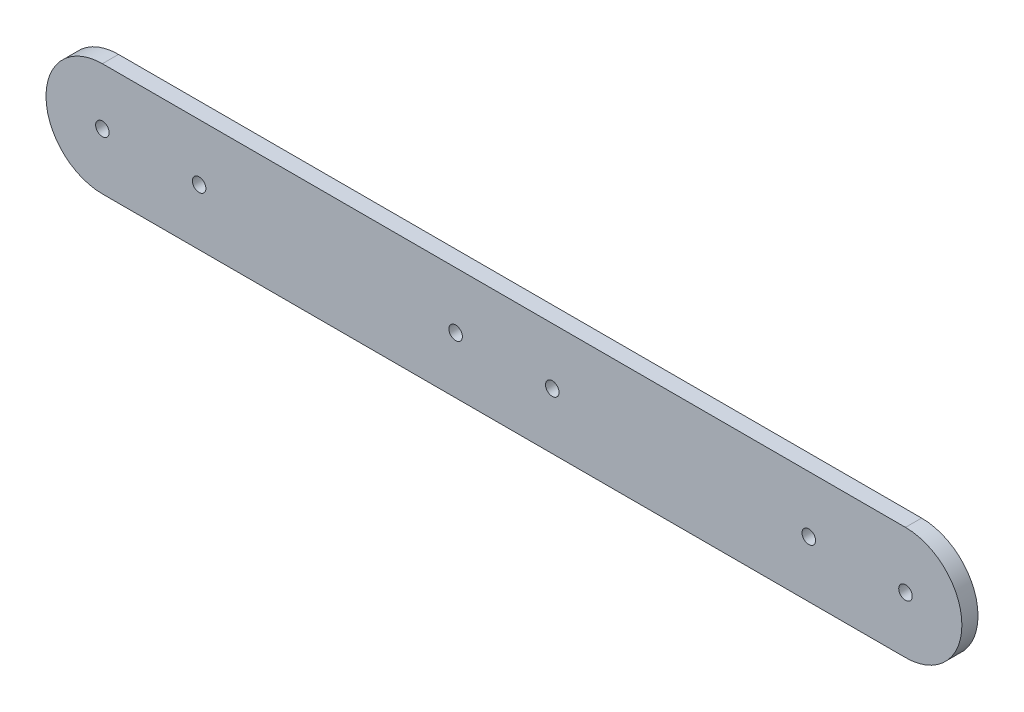
ISO-10303-21;
HEADER;
FILE_DESCRIPTION(('STEP AP214'),'2;1');
FILE_NAME('part.step','',(''),(''),'','','');
FILE_SCHEMA(('AUTOMOTIVE_DESIGN { 1 0 10303 214 1 1 1 1 }'));
ENDSEC;
DATA;
#1=APPLICATION_CONTEXT('core data for automotive mechanical design processes');
#2=APPLICATION_PROTOCOL_DEFINITION('international standard','automotive_design',2000,#1);
#3=PRODUCT_CONTEXT('',#1,'mechanical');
#4=PRODUCT('Part','Part','',(#3));
#5=PRODUCT_RELATED_PRODUCT_CATEGORY('part','',(#4));
#6=PRODUCT_DEFINITION_FORMATION('','',#4);
#7=PRODUCT_DEFINITION_CONTEXT('part definition',#1,'design');
#8=PRODUCT_DEFINITION('design','',#6,#7);
#9=PRODUCT_DEFINITION_SHAPE('','',#8);
#10=(LENGTH_UNIT() NAMED_UNIT(*) SI_UNIT(.MILLI.,.METRE.));
#11=(NAMED_UNIT(*) PLANE_ANGLE_UNIT() SI_UNIT($,.RADIAN.));
#12=(NAMED_UNIT(*) SI_UNIT($,.STERADIAN.) SOLID_ANGLE_UNIT());
#13=UNCERTAINTY_MEASURE_WITH_UNIT(LENGTH_MEASURE(1.E-05),#10,'distance_accuracy_value','');
#14=(GEOMETRIC_REPRESENTATION_CONTEXT(3) GLOBAL_UNCERTAINTY_ASSIGNED_CONTEXT((#13)) GLOBAL_UNIT_ASSIGNED_CONTEXT((#10,
#11,#12)) REPRESENTATION_CONTEXT('',''));
#15=CARTESIAN_POINT('',(0.,0.,0.));
#16=DIRECTION('',(0.,0.,1.));
#17=DIRECTION('',(1.,0.,0.));
#18=AXIS2_PLACEMENT_3D('',#15,#16,#17);
#19=CARTESIAN_POINT('',(51.6288857536475,81.700000000969,5.));
#20=DIRECTION('',(0.,0.,1.));
#21=DIRECTION('',(1.,0.,0.));
#22=AXIS2_PLACEMENT_3D('',#19,#20,#21);
#23=PLANE('',#22);
#24=CARTESIAN_POINT('',(81.6288857536475,81.700000000969,5.));
#25=DIRECTION('',(0.,0.,1.));
#26=DIRECTION('',(1.,0.,0.));
#27=AXIS2_PLACEMENT_3D('',#24,#25,#26);
#28=CIRCLE('',#27,2.1);
#29=CARTESIAN_POINT('',(83.7288857536475,81.700000000969,5.));
#30=VERTEX_POINT('',#29);
#31=EDGE_CURVE('E162',#30,#30,#28,.T.);
#32=ORIENTED_EDGE('',*,*,#31,.F.);
#33=EDGE_LOOP('',(#32));
#34=FACE_BOUND('',#33,.T.);
#35=CARTESIAN_POINT('',(191.222895530697,81.700000000969,5.));
#36=DIRECTION('',(0.,0.,1.));
#37=DIRECTION('',(1.,0.,0.));
#38=AXIS2_PLACEMENT_3D('',#35,#36,#37);
#39=CIRCLE('',#38,2.10000000000002);
#40=CARTESIAN_POINT('',(193.322895530697,81.700000000969,5.));
#41=VERTEX_POINT('',#40);
#42=EDGE_CURVE('E146',#41,#41,#39,.T.);
#43=ORIENTED_EDGE('',*,*,#42,.F.);
#44=EDGE_LOOP('',(#43));
#45=FACE_BOUND('',#44,.T.);
#46=CARTESIAN_POINT('',(300.816905307747,81.700000000969,5.));
#47=DIRECTION('',(0.,0.,1.));
#48=DIRECTION('',(1.,0.,0.));
#49=AXIS2_PLACEMENT_3D('',#46,#47,#48);
#50=CIRCLE('',#49,2.09999999999999);
#51=CARTESIAN_POINT('',(302.916905307747,81.700000000969,5.));
#52=VERTEX_POINT('',#51);
#53=EDGE_CURVE('E116',#52,#52,#50,.T.);
#54=ORIENTED_EDGE('',*,*,#53,.F.);
#55=EDGE_LOOP('',(#54));
#56=FACE_BOUND('',#55,.T.);
#57=CARTESIAN_POINT('',(51.6288857536475,81.700000000969,5.));
#58=DIRECTION('',(0.,0.,1.));
#59=DIRECTION('',(1.,0.,0.));
#60=AXIS2_PLACEMENT_3D('',#57,#58,#59);
#61=CIRCLE('',#60,17.5);
#62=CARTESIAN_POINT('',(51.6288857536475,99.200000000969,5.));
#63=VERTEX_POINT('',#62);
#64=CARTESIAN_POINT('',(51.6288857536475,64.200000000969,5.));
#65=VERTEX_POINT('',#64);
#66=EDGE_CURVE('E96',#63,#65,#61,.T.);
#67=ORIENTED_EDGE('',*,*,#66,.T.);
#68=DIRECTION('',(1.,0.,0.));
#69=VECTOR('',#68,1.);
#70=CARTESIAN_POINT('',(51.6288857536475,64.200000000969,5.));
#71=LINE('',#70,#69);
#72=CARTESIAN_POINT('',(300.816905307747,64.200000000969,5.));
#73=VERTEX_POINT('',#72);
#74=EDGE_CURVE('E91',#65,#73,#71,.T.);
#75=ORIENTED_EDGE('',*,*,#74,.T.);
#76=CARTESIAN_POINT('',(300.816905307747,81.700000000969,5.));
#77=DIRECTION('',(0.,0.,1.));
#78=DIRECTION('',(1.,0.,0.));
#79=AXIS2_PLACEMENT_3D('',#76,#77,#78);
#80=CIRCLE('',#79,17.5);
#81=CARTESIAN_POINT('',(300.816905307747,99.200000000969,5.));
#82=VERTEX_POINT('',#81);
#83=EDGE_CURVE('E94',#73,#82,#80,.T.);
#84=ORIENTED_EDGE('',*,*,#83,.T.);
#85=DIRECTION('',(-1.,0.,0.));
#86=VECTOR('',#85,1.);
#87=CARTESIAN_POINT('',(51.6288857536475,99.200000000969,5.));
#88=LINE('',#87,#86);
#89=EDGE_CURVE('E61',#82,#63,#88,.T.);
#90=ORIENTED_EDGE('',*,*,#89,.T.);
#91=EDGE_LOOP('',(#67,#75,#84,#90));
#92=FACE_BOUND('',#91,.T.);
#93=CARTESIAN_POINT('',(270.816905307747,81.700000000969,5.));
#94=DIRECTION('',(0.,0.,1.));
#95=DIRECTION('',(1.,0.,0.));
#96=AXIS2_PLACEMENT_3D('',#93,#94,#95);
#97=CIRCLE('',#96,2.09999999999999);
#98=CARTESIAN_POINT('',(272.916905307747,81.700000000969,5.));
#99=VERTEX_POINT('',#98);
#100=EDGE_CURVE('E138',#99,#99,#97,.T.);
#101=ORIENTED_EDGE('',*,*,#100,.F.);
#102=EDGE_LOOP('',(#101));
#103=FACE_BOUND('',#102,.T.);
#104=CARTESIAN_POINT('',(51.6288857536475,81.700000000969,5.));
#105=DIRECTION('',(0.,0.,1.));
#106=DIRECTION('',(1.,0.,0.));
#107=AXIS2_PLACEMENT_3D('',#104,#105,#106);
#108=CIRCLE('',#107,2.1);
#109=CARTESIAN_POINT('',(53.7288857536475,81.700000000969,5.));
#110=VERTEX_POINT('',#109);
#111=EDGE_CURVE('E154',#110,#110,#108,.T.);
#112=ORIENTED_EDGE('',*,*,#111,.F.);
#113=EDGE_LOOP('',(#112));
#114=FACE_BOUND('',#113,.T.);
#115=CARTESIAN_POINT('',(161.222895530697,81.700000000969,5.));
#116=DIRECTION('',(0.,0.,1.));
#117=DIRECTION('',(1.,0.,0.));
#118=AXIS2_PLACEMENT_3D('',#115,#116,#117);
#119=CIRCLE('',#118,2.09999999999999);
#120=CARTESIAN_POINT('',(163.322895530697,81.700000000969,5.));
#121=VERTEX_POINT('',#120);
#122=EDGE_CURVE('E170',#121,#121,#119,.T.);
#123=ORIENTED_EDGE('',*,*,#122,.F.);
#124=EDGE_LOOP('',(#123));
#125=FACE_BOUND('',#124,.T.);
#126=ADVANCED_FACE('F43',(#34,#45,#56,#92,#103,#114,#125),#23,.T.);
#127=CARTESIAN_POINT('',(51.6288857536475,81.700000000969,0.));
#128=DIRECTION('',(0.,0.,1.));
#129=DIRECTION('',(1.,0.,0.));
#130=AXIS2_PLACEMENT_3D('',#127,#128,#129);
#131=PLANE('',#130);
#132=CARTESIAN_POINT('',(51.6288857536475,81.700000000969,0.));
#133=DIRECTION('',(0.,0.,1.));
#134=DIRECTION('',(1.,0.,0.));
#135=AXIS2_PLACEMENT_3D('',#132,#133,#134);
#136=CIRCLE('',#135,17.5);
#137=CARTESIAN_POINT('',(51.6288857536475,99.200000000969,0.));
#138=VERTEX_POINT('',#137);
#139=CARTESIAN_POINT('',(51.6288857536475,64.200000000969,0.));
#140=VERTEX_POINT('',#139);
#141=EDGE_CURVE('E112',#138,#140,#136,.T.);
#142=ORIENTED_EDGE('',*,*,#141,.F.);
#143=DIRECTION('',(-1.,0.,0.));
#144=VECTOR('',#143,1.);
#145=CARTESIAN_POINT('',(51.6288857536475,99.200000000969,0.));
#146=LINE('',#145,#144);
#147=CARTESIAN_POINT('',(300.816905307747,99.200000000969,0.));
#148=VERTEX_POINT('',#147);
#149=EDGE_CURVE('E84',#148,#138,#146,.T.);
#150=ORIENTED_EDGE('',*,*,#149,.F.);
#151=CARTESIAN_POINT('',(300.816905307747,81.700000000969,0.));
#152=DIRECTION('',(0.,0.,1.));
#153=DIRECTION('',(1.,0.,0.));
#154=AXIS2_PLACEMENT_3D('',#151,#152,#153);
#155=CIRCLE('',#154,17.5);
#156=CARTESIAN_POINT('',(300.816905307747,64.200000000969,0.));
#157=VERTEX_POINT('',#156);
#158=EDGE_CURVE('E78',#157,#148,#155,.T.);
#159=ORIENTED_EDGE('',*,*,#158,.F.);
#160=DIRECTION('',(1.,0.,0.));
#161=VECTOR('',#160,1.);
#162=CARTESIAN_POINT('',(51.6288857536475,64.200000000969,0.));
#163=LINE('',#162,#161);
#164=EDGE_CURVE('E101',#140,#157,#163,.T.);
#165=ORIENTED_EDGE('',*,*,#164,.F.);
#166=EDGE_LOOP('',(#142,#150,#159,#165));
#167=FACE_BOUND('',#166,.T.);
#168=CARTESIAN_POINT('',(300.816905307747,81.700000000969,0.));
#169=DIRECTION('',(0.,0.,1.));
#170=DIRECTION('',(1.,0.,0.));
#171=AXIS2_PLACEMENT_3D('',#168,#169,#170);
#172=CIRCLE('',#171,2.09999999999999);
#173=CARTESIAN_POINT('',(302.916905307747,81.700000000969,0.));
#174=VERTEX_POINT('',#173);
#175=EDGE_CURVE('E134',#174,#174,#172,.T.);
#176=ORIENTED_EDGE('',*,*,#175,.T.);
#177=EDGE_LOOP('',(#176));
#178=FACE_BOUND('',#177,.T.);
#179=CARTESIAN_POINT('',(270.816905307747,81.700000000969,0.));
#180=DIRECTION('',(0.,0.,1.));
#181=DIRECTION('',(1.,0.,0.));
#182=AXIS2_PLACEMENT_3D('',#179,#180,#181);
#183=CIRCLE('',#182,2.09999999999999);
#184=CARTESIAN_POINT('',(272.916905307747,81.700000000969,0.));
#185=VERTEX_POINT('',#184);
#186=EDGE_CURVE('E142',#185,#185,#183,.T.);
#187=ORIENTED_EDGE('',*,*,#186,.T.);
#188=EDGE_LOOP('',(#187));
#189=FACE_BOUND('',#188,.T.);
#190=CARTESIAN_POINT('',(191.222895530697,81.700000000969,0.));
#191=DIRECTION('',(0.,0.,1.));
#192=DIRECTION('',(1.,0.,0.));
#193=AXIS2_PLACEMENT_3D('',#190,#191,#192);
#194=CIRCLE('',#193,2.10000000000002);
#195=CARTESIAN_POINT('',(193.322895530697,81.700000000969,0.));
#196=VERTEX_POINT('',#195);
#197=EDGE_CURVE('E150',#196,#196,#194,.T.);
#198=ORIENTED_EDGE('',*,*,#197,.T.);
#199=EDGE_LOOP('',(#198));
#200=FACE_BOUND('',#199,.T.);
#201=CARTESIAN_POINT('',(51.6288857536475,81.700000000969,0.));
#202=DIRECTION('',(0.,0.,1.));
#203=DIRECTION('',(1.,0.,0.));
#204=AXIS2_PLACEMENT_3D('',#201,#202,#203);
#205=CIRCLE('',#204,2.1);
#206=CARTESIAN_POINT('',(53.7288857536475,81.700000000969,0.));
#207=VERTEX_POINT('',#206);
#208=EDGE_CURVE('E158',#207,#207,#205,.T.);
#209=ORIENTED_EDGE('',*,*,#208,.T.);
#210=EDGE_LOOP('',(#209));
#211=FACE_BOUND('',#210,.T.);
#212=CARTESIAN_POINT('',(81.6288857536475,81.700000000969,0.));
#213=DIRECTION('',(0.,0.,1.));
#214=DIRECTION('',(1.,0.,0.));
#215=AXIS2_PLACEMENT_3D('',#212,#213,#214);
#216=CIRCLE('',#215,2.1);
#217=CARTESIAN_POINT('',(83.7288857536475,81.700000000969,0.));
#218=VERTEX_POINT('',#217);
#219=EDGE_CURVE('E166',#218,#218,#216,.T.);
#220=ORIENTED_EDGE('',*,*,#219,.T.);
#221=EDGE_LOOP('',(#220));
#222=FACE_BOUND('',#221,.T.);
#223=CARTESIAN_POINT('',(161.222895530697,81.700000000969,0.));
#224=DIRECTION('',(0.,0.,1.));
#225=DIRECTION('',(1.,0.,0.));
#226=AXIS2_PLACEMENT_3D('',#223,#224,#225);
#227=CIRCLE('',#226,2.09999999999999);
#228=CARTESIAN_POINT('',(163.322895530697,81.700000000969,0.));
#229=VERTEX_POINT('',#228);
#230=EDGE_CURVE('E174',#229,#229,#227,.T.);
#231=ORIENTED_EDGE('',*,*,#230,.T.);
#232=EDGE_LOOP('',(#231));
#233=FACE_BOUND('',#232,.T.);
#234=ADVANCED_FACE('F129',(#167,#178,#189,#200,#211,#222,#233),#131,.F.);
#235=CARTESIAN_POINT('',(51.6288857536475,81.700000000969,5.));
#236=DIRECTION('',(0.,0.,-1.));
#237=DIRECTION('',(-1.,0.,0.));
#238=AXIS2_PLACEMENT_3D('',#235,#236,#237);
#239=CYLINDRICAL_SURFACE('',#238,17.5);
#240=ORIENTED_EDGE('',*,*,#141,.T.);
#241=DIRECTION('',(0.,0.,-1.));
#242=VECTOR('',#241,1.);
#243=CARTESIAN_POINT('',(51.6288857536475,64.200000000969,5.));
#244=LINE('',#243,#242);
#245=EDGE_CURVE('E11',#65,#140,#244,.T.);
#246=ORIENTED_EDGE('',*,*,#245,.F.);
#247=ORIENTED_EDGE('',*,*,#66,.F.);
#248=DIRECTION('',(0.,0.,-1.));
#249=VECTOR('',#248,1.);
#250=CARTESIAN_POINT('',(51.6288857536475,99.200000000969,5.));
#251=LINE('',#250,#249);
#252=EDGE_CURVE('E108',#63,#138,#251,.T.);
#253=ORIENTED_EDGE('',*,*,#252,.T.);
#254=EDGE_LOOP('',(#240,#246,#247,#253));
#255=FACE_BOUND('',#254,.T.);
#256=ADVANCED_FACE('F45',(#255),#239,.T.);
#257=CARTESIAN_POINT('',(51.6288857536475,64.200000000969,5.));
#258=DIRECTION('',(0.,1.,0.));
#259=DIRECTION('',(-1.,0.,0.));
#260=AXIS2_PLACEMENT_3D('',#257,#258,#259);
#261=PLANE('',#260);
#262=ORIENTED_EDGE('',*,*,#164,.T.);
#263=DIRECTION('',(0.,0.,-1.));
#264=VECTOR('',#263,1.);
#265=CARTESIAN_POINT('',(300.816905307747,64.200000000969,5.));
#266=LINE('',#265,#264);
#267=EDGE_CURVE('E53',#73,#157,#266,.T.);
#268=ORIENTED_EDGE('',*,*,#267,.F.);
#269=ORIENTED_EDGE('',*,*,#74,.F.);
#270=ORIENTED_EDGE('',*,*,#245,.T.);
#271=EDGE_LOOP('',(#262,#268,#269,#270));
#272=FACE_BOUND('',#271,.T.);
#273=ADVANCED_FACE('F100',(#272),#261,.F.);
#274=CARTESIAN_POINT('',(300.816905307747,81.700000000969,5.));
#275=DIRECTION('',(0.,0.,-1.));
#276=DIRECTION('',(-1.,0.,0.));
#277=AXIS2_PLACEMENT_3D('',#274,#275,#276);
#278=CYLINDRICAL_SURFACE('',#277,17.5);
#279=ORIENTED_EDGE('',*,*,#158,.T.);
#280=DIRECTION('',(0.,0.,-1.));
#281=VECTOR('',#280,1.);
#282=CARTESIAN_POINT('',(300.816905307747,99.200000000969,5.));
#283=LINE('',#282,#281);
#284=EDGE_CURVE('E103',#82,#148,#283,.T.);
#285=ORIENTED_EDGE('',*,*,#284,.F.);
#286=ORIENTED_EDGE('',*,*,#83,.F.);
#287=ORIENTED_EDGE('',*,*,#267,.T.);
#288=EDGE_LOOP('',(#279,#285,#286,#287));
#289=FACE_BOUND('',#288,.T.);
#290=ADVANCED_FACE('F104',(#289),#278,.T.);
#291=CARTESIAN_POINT('',(51.6288857536475,99.200000000969,5.));
#292=DIRECTION('',(0.,-1.,0.));
#293=DIRECTION('',(1.,0.,0.));
#294=AXIS2_PLACEMENT_3D('',#291,#292,#293);
#295=PLANE('',#294);
#296=ORIENTED_EDGE('',*,*,#149,.T.);
#297=ORIENTED_EDGE('',*,*,#252,.F.);
#298=ORIENTED_EDGE('',*,*,#89,.F.);
#299=ORIENTED_EDGE('',*,*,#284,.T.);
#300=EDGE_LOOP('',(#296,#297,#298,#299));
#301=FACE_BOUND('',#300,.T.);
#302=ADVANCED_FACE('F126',(#301),#295,.F.);
#303=CARTESIAN_POINT('',(300.816905307747,81.700000000969,5.));
#304=DIRECTION('',(0.,0.,-1.));
#305=DIRECTION('',(-1.,0.,0.));
#306=AXIS2_PLACEMENT_3D('',#303,#304,#305);
#307=CYLINDRICAL_SURFACE('',#306,2.09999999999999);
#308=ORIENTED_EDGE('',*,*,#53,.T.);
#309=EDGE_LOOP('',(#308));
#310=FACE_BOUND('',#309,.T.);
#311=ORIENTED_EDGE('',*,*,#175,.F.);
#312=EDGE_LOOP('',(#311));
#313=FACE_BOUND('',#312,.T.);
#314=ADVANCED_FACE('F195',(#310,#313),#307,.F.);
#315=CARTESIAN_POINT('',(270.816905307747,81.700000000969,5.));
#316=DIRECTION('',(0.,0.,-1.));
#317=DIRECTION('',(-1.,0.,0.));
#318=AXIS2_PLACEMENT_3D('',#315,#316,#317);
#319=CYLINDRICAL_SURFACE('',#318,2.09999999999999);
#320=ORIENTED_EDGE('',*,*,#100,.T.);
#321=EDGE_LOOP('',(#320));
#322=FACE_BOUND('',#321,.T.);
#323=ORIENTED_EDGE('',*,*,#186,.F.);
#324=EDGE_LOOP('',(#323));
#325=FACE_BOUND('',#324,.T.);
#326=ADVANCED_FACE('F249',(#322,#325),#319,.F.);
#327=CARTESIAN_POINT('',(191.222895530697,81.700000000969,5.));
#328=DIRECTION('',(0.,0.,-1.));
#329=DIRECTION('',(-1.,0.,0.));
#330=AXIS2_PLACEMENT_3D('',#327,#328,#329);
#331=CYLINDRICAL_SURFACE('',#330,2.10000000000002);
#332=ORIENTED_EDGE('',*,*,#42,.T.);
#333=EDGE_LOOP('',(#332));
#334=FACE_BOUND('',#333,.T.);
#335=ORIENTED_EDGE('',*,*,#197,.F.);
#336=EDGE_LOOP('',(#335));
#337=FACE_BOUND('',#336,.T.);
#338=ADVANCED_FACE('F258',(#334,#337),#331,.F.);
#339=CARTESIAN_POINT('',(51.6288857536475,81.700000000969,5.));
#340=DIRECTION('',(0.,0.,-1.));
#341=DIRECTION('',(-1.,0.,0.));
#342=AXIS2_PLACEMENT_3D('',#339,#340,#341);
#343=CYLINDRICAL_SURFACE('',#342,2.1);
#344=ORIENTED_EDGE('',*,*,#111,.T.);
#345=EDGE_LOOP('',(#344));
#346=FACE_BOUND('',#345,.T.);
#347=ORIENTED_EDGE('',*,*,#208,.F.);
#348=EDGE_LOOP('',(#347));
#349=FACE_BOUND('',#348,.T.);
#350=ADVANCED_FACE('F267',(#346,#349),#343,.F.);
#351=CARTESIAN_POINT('',(81.6288857536475,81.700000000969,5.));
#352=DIRECTION('',(0.,0.,-1.));
#353=DIRECTION('',(-1.,0.,0.));
#354=AXIS2_PLACEMENT_3D('',#351,#352,#353);
#355=CYLINDRICAL_SURFACE('',#354,2.1);
#356=ORIENTED_EDGE('',*,*,#31,.T.);
#357=EDGE_LOOP('',(#356));
#358=FACE_BOUND('',#357,.T.);
#359=ORIENTED_EDGE('',*,*,#219,.F.);
#360=EDGE_LOOP('',(#359));
#361=FACE_BOUND('',#360,.T.);
#362=ADVANCED_FACE('F277',(#358,#361),#355,.F.);
#363=CARTESIAN_POINT('',(161.222895530697,81.700000000969,5.));
#364=DIRECTION('',(0.,0.,-1.));
#365=DIRECTION('',(-1.,0.,0.));
#366=AXIS2_PLACEMENT_3D('',#363,#364,#365);
#367=CYLINDRICAL_SURFACE('',#366,2.09999999999999);
#368=ORIENTED_EDGE('',*,*,#122,.T.);
#369=EDGE_LOOP('',(#368));
#370=FACE_BOUND('',#369,.T.);
#371=ORIENTED_EDGE('',*,*,#230,.F.);
#372=EDGE_LOOP('',(#371));
#373=FACE_BOUND('',#372,.T.);
#374=ADVANCED_FACE('F182',(#370,#373),#367,.F.);
#375=CLOSED_SHELL('',(#126,#234,#256,#273,#290,#302,#314,#326,#338,#350,#362,#374));
#376=MANIFOLD_SOLID_BREP('B2',#375);
#377=ADVANCED_BREP_SHAPE_REPRESENTATION('',(#18,#376),#14);
#378=SHAPE_DEFINITION_REPRESENTATION(#9,#377);
ENDSEC;
END-ISO-10303-21;
